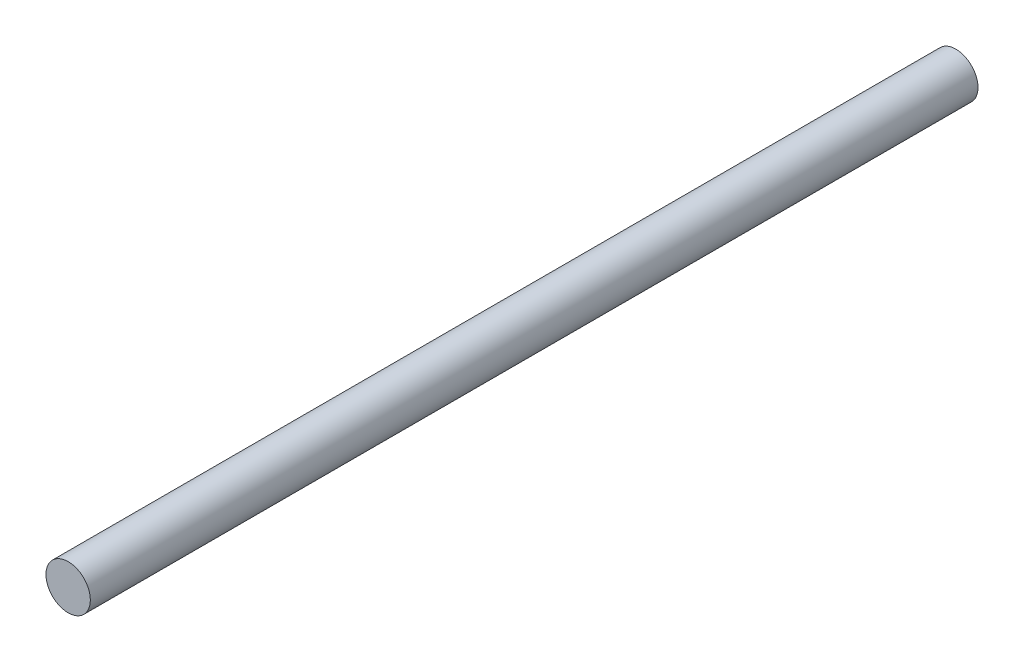
ISO-10303-21;
HEADER;
FILE_DESCRIPTION(('STEP AP214'),'2;1');
FILE_NAME('part.step','',(''),(''),'','','');
FILE_SCHEMA(('AUTOMOTIVE_DESIGN { 1 0 10303 214 1 1 1 1 }'));
ENDSEC;
DATA;
#1=APPLICATION_CONTEXT('core data for automotive mechanical design processes');
#2=APPLICATION_PROTOCOL_DEFINITION('international standard','automotive_design',2000,#1);
#3=PRODUCT_CONTEXT('',#1,'mechanical');
#4=PRODUCT('Part','Part','',(#3));
#5=PRODUCT_RELATED_PRODUCT_CATEGORY('part','',(#4));
#6=PRODUCT_DEFINITION_FORMATION('','',#4);
#7=PRODUCT_DEFINITION_CONTEXT('part definition',#1,'design');
#8=PRODUCT_DEFINITION('design','',#6,#7);
#9=PRODUCT_DEFINITION_SHAPE('','',#8);
#10=(LENGTH_UNIT() NAMED_UNIT(*) SI_UNIT(.MILLI.,.METRE.));
#11=(NAMED_UNIT(*) PLANE_ANGLE_UNIT() SI_UNIT($,.RADIAN.));
#12=(NAMED_UNIT(*) SI_UNIT($,.STERADIAN.) SOLID_ANGLE_UNIT());
#13=UNCERTAINTY_MEASURE_WITH_UNIT(LENGTH_MEASURE(1.E-05),#10,'distance_accuracy_value','');
#14=(GEOMETRIC_REPRESENTATION_CONTEXT(3) GLOBAL_UNCERTAINTY_ASSIGNED_CONTEXT((#13)) GLOBAL_UNIT_ASSIGNED_CONTEXT((#10,
#11,#12)) REPRESENTATION_CONTEXT('',''));
#15=CARTESIAN_POINT('',(0.,0.,0.));
#16=DIRECTION('',(0.,0.,1.));
#17=DIRECTION('',(1.,0.,0.));
#18=AXIS2_PLACEMENT_3D('',#15,#16,#17);
#19=CARTESIAN_POINT('',(0.,0.,120.));
#20=DIRECTION('',(0.,0.,-1.));
#21=DIRECTION('',(-1.,0.,0.));
#22=AXIS2_PLACEMENT_3D('',#19,#20,#21);
#23=CYLINDRICAL_SURFACE('',#22,3.);
#24=CARTESIAN_POINT('',(0.,0.,120.));
#25=DIRECTION('',(0.,0.,1.));
#26=DIRECTION('',(1.,0.,0.));
#27=AXIS2_PLACEMENT_3D('',#24,#25,#26);
#28=CIRCLE('',#27,3.);
#29=CARTESIAN_POINT('',(3.,0.,120.));
#30=VERTEX_POINT('',#29);
#31=EDGE_CURVE('E10',#30,#30,#28,.T.);
#32=ORIENTED_EDGE('',*,*,#31,.F.);
#33=EDGE_LOOP('',(#32));
#34=FACE_BOUND('',#33,.T.);
#35=CARTESIAN_POINT('',(0.,0.,0.));
#36=DIRECTION('',(0.,0.,1.));
#37=DIRECTION('',(1.,0.,0.));
#38=AXIS2_PLACEMENT_3D('',#35,#36,#37);
#39=CIRCLE('',#38,3.);
#40=CARTESIAN_POINT('',(3.,0.,0.));
#41=VERTEX_POINT('',#40);
#42=EDGE_CURVE('E34',#41,#41,#39,.T.);
#43=ORIENTED_EDGE('',*,*,#42,.T.);
#44=EDGE_LOOP('',(#43));
#45=FACE_BOUND('',#44,.T.);
#46=ADVANCED_FACE('F31',(#34,#45),#23,.T.);
#47=CARTESIAN_POINT('',(0.,0.,120.));
#48=DIRECTION('',(0.,0.,1.));
#49=DIRECTION('',(1.,0.,0.));
#50=AXIS2_PLACEMENT_3D('',#47,#48,#49);
#51=PLANE('',#50);
#52=ORIENTED_EDGE('',*,*,#31,.T.);
#53=EDGE_LOOP('',(#52));
#54=FACE_BOUND('',#53,.T.);
#55=ADVANCED_FACE('F46',(#54),#51,.T.);
#56=CARTESIAN_POINT('',(0.,0.,0.));
#57=DIRECTION('',(0.,0.,1.));
#58=DIRECTION('',(1.,0.,0.));
#59=AXIS2_PLACEMENT_3D('',#56,#57,#58);
#60=PLANE('',#59);
#61=ORIENTED_EDGE('',*,*,#42,.F.);
#62=EDGE_LOOP('',(#61));
#63=FACE_BOUND('',#62,.T.);
#64=ADVANCED_FACE('F44',(#63),#60,.F.);
#65=CLOSED_SHELL('',(#46,#55,#64));
#66=MANIFOLD_SOLID_BREP('B2',#65);
#67=ADVANCED_BREP_SHAPE_REPRESENTATION('',(#18,#66),#14);
#68=SHAPE_DEFINITION_REPRESENTATION(#9,#67);
ENDSEC;
END-ISO-10303-21;
